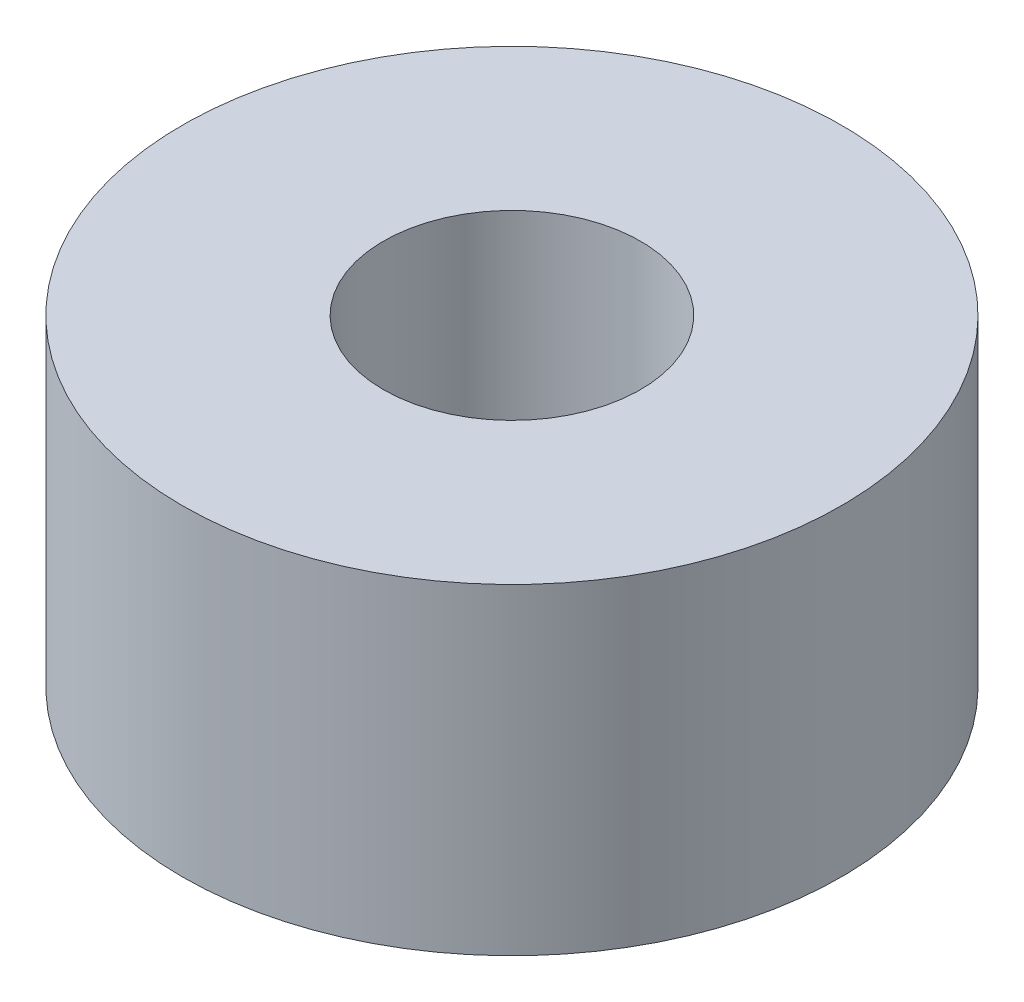
ISO-10303-21;
HEADER;
FILE_DESCRIPTION(('STEP AP214'),'2;1');
FILE_NAME('part.step','',(''),(''),'','','');
FILE_SCHEMA(('AUTOMOTIVE_DESIGN { 1 0 10303 214 1 1 1 1 }'));
ENDSEC;
DATA;
#1=APPLICATION_CONTEXT('core data for automotive mechanical design processes');
#2=APPLICATION_PROTOCOL_DEFINITION('international standard','automotive_design',2000,#1);
#3=PRODUCT_CONTEXT('',#1,'mechanical');
#4=PRODUCT('Part','Part','',(#3));
#5=PRODUCT_RELATED_PRODUCT_CATEGORY('part','',(#4));
#6=PRODUCT_DEFINITION_FORMATION('','',#4);
#7=PRODUCT_DEFINITION_CONTEXT('part definition',#1,'design');
#8=PRODUCT_DEFINITION('design','',#6,#7);
#9=PRODUCT_DEFINITION_SHAPE('','',#8);
#10=(LENGTH_UNIT() NAMED_UNIT(*) SI_UNIT(.MILLI.,.METRE.));
#11=(NAMED_UNIT(*) PLANE_ANGLE_UNIT() SI_UNIT($,.RADIAN.));
#12=(NAMED_UNIT(*) SI_UNIT($,.STERADIAN.) SOLID_ANGLE_UNIT());
#13=UNCERTAINTY_MEASURE_WITH_UNIT(LENGTH_MEASURE(1.E-05),#10,'distance_accuracy_value','');
#14=(GEOMETRIC_REPRESENTATION_CONTEXT(3) GLOBAL_UNCERTAINTY_ASSIGNED_CONTEXT((#13)) GLOBAL_UNIT_ASSIGNED_CONTEXT((#10,
#11,#12)) REPRESENTATION_CONTEXT('',''));
#15=CARTESIAN_POINT('',(0.,0.,0.));
#16=DIRECTION('',(0.,0.,1.));
#17=DIRECTION('',(1.,0.,0.));
#18=AXIS2_PLACEMENT_3D('',#15,#16,#17);
#19=CARTESIAN_POINT('',(0.,5.08,0.));
#20=DIRECTION('',(0.,1.,0.));
#21=DIRECTION('',(0.,0.,1.));
#22=AXIS2_PLACEMENT_3D('',#19,#20,#21);
#23=PLANE('',#22);
#24=CARTESIAN_POINT('',(0.,5.08,0.));
#25=DIRECTION('',(0.,1.,0.));
#26=DIRECTION('',(0.,0.,1.));
#27=AXIS2_PLACEMENT_3D('',#24,#25,#26);
#28=CIRCLE('',#27,5.207);
#29=CARTESIAN_POINT('',(0.,5.08,5.207));
#30=VERTEX_POINT('',#29);
#31=EDGE_CURVE('E10',#30,#30,#28,.T.);
#32=ORIENTED_EDGE('',*,*,#31,.T.);
#33=EDGE_LOOP('',(#32));
#34=FACE_BOUND('',#33,.T.);
#35=CARTESIAN_POINT('',(0.,5.08,0.));
#36=DIRECTION('',(0.,1.,0.));
#37=DIRECTION('',(0.,0.,1.));
#38=AXIS2_PLACEMENT_3D('',#35,#36,#37);
#39=CIRCLE('',#38,2.032);
#40=CARTESIAN_POINT('',(0.,5.08,2.032));
#41=VERTEX_POINT('',#40);
#42=EDGE_CURVE('E44',#41,#41,#39,.T.);
#43=ORIENTED_EDGE('',*,*,#42,.F.);
#44=EDGE_LOOP('',(#43));
#45=FACE_BOUND('',#44,.T.);
#46=ADVANCED_FACE('F33',(#34,#45),#23,.T.);
#47=CARTESIAN_POINT('',(0.,0.,0.));
#48=DIRECTION('',(0.,1.,0.));
#49=DIRECTION('',(0.,0.,1.));
#50=AXIS2_PLACEMENT_3D('',#47,#48,#49);
#51=PLANE('',#50);
#52=CARTESIAN_POINT('',(0.,0.,0.));
#53=DIRECTION('',(0.,1.,0.));
#54=DIRECTION('',(0.,0.,1.));
#55=AXIS2_PLACEMENT_3D('',#52,#53,#54);
#56=CIRCLE('',#55,5.207);
#57=CARTESIAN_POINT('',(0.,0.,5.207));
#58=VERTEX_POINT('',#57);
#59=EDGE_CURVE('E37',#58,#58,#56,.T.);
#60=ORIENTED_EDGE('',*,*,#59,.F.);
#61=EDGE_LOOP('',(#60));
#62=FACE_BOUND('',#61,.T.);
#63=CARTESIAN_POINT('',(0.,0.,0.));
#64=DIRECTION('',(0.,1.,0.));
#65=DIRECTION('',(0.,0.,1.));
#66=AXIS2_PLACEMENT_3D('',#63,#64,#65);
#67=CIRCLE('',#66,2.032);
#68=CARTESIAN_POINT('',(0.,0.,2.032));
#69=VERTEX_POINT('',#68);
#70=EDGE_CURVE('E46',#69,#69,#67,.T.);
#71=ORIENTED_EDGE('',*,*,#70,.T.);
#72=EDGE_LOOP('',(#71));
#73=FACE_BOUND('',#72,.T.);
#74=ADVANCED_FACE('F56',(#62,#73),#51,.F.);
#75=CARTESIAN_POINT('',(0.,5.08,0.));
#76=DIRECTION('',(0.,-1.,0.));
#77=DIRECTION('',(0.,0.,-1.));
#78=AXIS2_PLACEMENT_3D('',#75,#76,#77);
#79=CYLINDRICAL_SURFACE('',#78,5.207);
#80=ORIENTED_EDGE('',*,*,#31,.F.);
#81=EDGE_LOOP('',(#80));
#82=FACE_BOUND('',#81,.T.);
#83=ORIENTED_EDGE('',*,*,#59,.T.);
#84=EDGE_LOOP('',(#83));
#85=FACE_BOUND('',#84,.T.);
#86=ADVANCED_FACE('F35',(#82,#85),#79,.T.);
#87=CARTESIAN_POINT('',(0.,5.08,0.));
#88=DIRECTION('',(0.,-1.,0.));
#89=DIRECTION('',(0.,0.,-1.));
#90=AXIS2_PLACEMENT_3D('',#87,#88,#89);
#91=CYLINDRICAL_SURFACE('',#90,2.032);
#92=ORIENTED_EDGE('',*,*,#42,.T.);
#93=EDGE_LOOP('',(#92));
#94=FACE_BOUND('',#93,.T.);
#95=ORIENTED_EDGE('',*,*,#70,.F.);
#96=EDGE_LOOP('',(#95));
#97=FACE_BOUND('',#96,.T.);
#98=ADVANCED_FACE('F52',(#94,#97),#91,.F.);
#99=CLOSED_SHELL('',(#46,#74,#86,#98));
#100=MANIFOLD_SOLID_BREP('B2',#99);
#101=ADVANCED_BREP_SHAPE_REPRESENTATION('',(#18,#100),#14);
#102=SHAPE_DEFINITION_REPRESENTATION(#9,#101);
ENDSEC;
END-ISO-10303-21;
